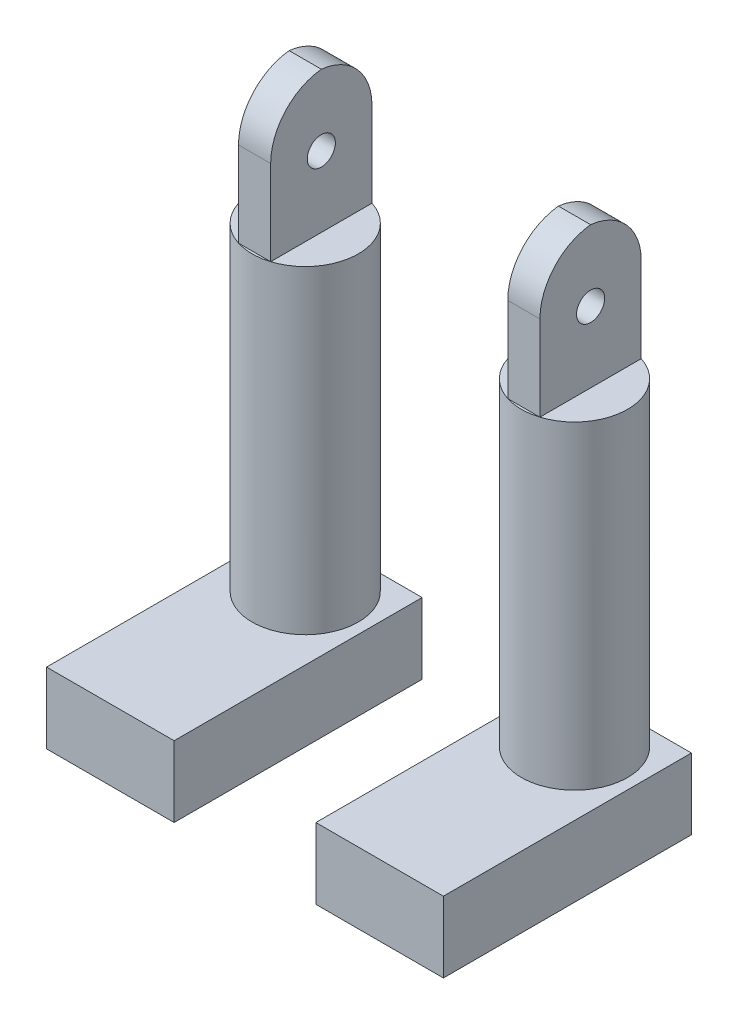
ISO-10303-21;
HEADER;
FILE_DESCRIPTION(('STEP AP214'),'2;1');
FILE_NAME('part.step','',(''),(''),'','','');
FILE_SCHEMA(('AUTOMOTIVE_DESIGN { 1 0 10303 214 1 1 1 1 }'));
ENDSEC;
DATA;
#1=APPLICATION_CONTEXT('core data for automotive mechanical design processes');
#2=APPLICATION_PROTOCOL_DEFINITION('international standard','automotive_design',2000,#1);
#3=PRODUCT_CONTEXT('',#1,'mechanical');
#4=PRODUCT('Part','Part','',(#3));
#5=PRODUCT_RELATED_PRODUCT_CATEGORY('part','',(#4));
#6=PRODUCT_DEFINITION_FORMATION('','',#4);
#7=PRODUCT_DEFINITION_CONTEXT('part definition',#1,'design');
#8=PRODUCT_DEFINITION('design','',#6,#7);
#9=PRODUCT_DEFINITION_SHAPE('','',#8);
#10=(LENGTH_UNIT() NAMED_UNIT(*) SI_UNIT(.MILLI.,.METRE.));
#11=(NAMED_UNIT(*) PLANE_ANGLE_UNIT() SI_UNIT($,.RADIAN.));
#12=(NAMED_UNIT(*) SI_UNIT($,.STERADIAN.) SOLID_ANGLE_UNIT());
#13=UNCERTAINTY_MEASURE_WITH_UNIT(LENGTH_MEASURE(1.E-05),#10,'distance_accuracy_value','');
#14=(GEOMETRIC_REPRESENTATION_CONTEXT(3) GLOBAL_UNCERTAINTY_ASSIGNED_CONTEXT((#13)) GLOBAL_UNIT_ASSIGNED_CONTEXT((#10,
#11,#12)) REPRESENTATION_CONTEXT('',''));
#15=CARTESIAN_POINT('',(0.,0.,0.));
#16=DIRECTION('',(0.,0.,1.));
#17=DIRECTION('',(1.,0.,0.));
#18=AXIS2_PLACEMENT_3D('',#15,#16,#17);
#19=CARTESIAN_POINT('',(-160.000000000001,550.,-100.));
#20=DIRECTION('',(0.,1.,0.));
#21=DIRECTION('',(0.,0.,1.));
#22=AXIS2_PLACEMENT_3D('',#19,#20,#21);
#23=PLANE('',#22);
#24=DIRECTION('',(0.,0.,-1.));
#25=VECTOR('',#24,1.);
#26=CARTESIAN_POINT('',(-137.290288108403,550.,-28.5208492929542));
#27=LINE('',#26,#25);
#28=CARTESIAN_POINT('',(-137.290288108403,550.,-28.5208492929542));
#29=VERTEX_POINT('',#28);
#30=CARTESIAN_POINT('',(-137.290288108403,550.,-171.479150707046));
#31=VERTEX_POINT('',#30);
#32=EDGE_CURVE('E166',#29,#31,#27,.T.);
#33=ORIENTED_EDGE('',*,*,#32,.F.);
#34=CARTESIAN_POINT('',(-160.000000000001,550.,-100.));
#35=DIRECTION('',(0.,1.,0.));
#36=DIRECTION('',(0.,0.,1.));
#37=AXIS2_PLACEMENT_3D('',#34,#35,#36);
#38=CIRCLE('',#37,75.);
#39=EDGE_CURVE('E149',#29,#31,#38,.T.);
#40=ORIENTED_EDGE('',*,*,#39,.T.);
#41=EDGE_LOOP('',(#33,#40));
#42=FACE_BOUND('',#41,.T.);
#43=ADVANCED_FACE('F49',(#42),#23,.T.);
#44=DIRECTION('',(1.,0.,0.));
#45=VECTOR('',#44,1.);
#46=CARTESIAN_POINT('',(-182.709711891599,550.,-28.5208492929542));
#47=LINE('',#46,#45);
#48=CARTESIAN_POINT('',(-182.709711891599,550.,-28.5208492929542));
#49=VERTEX_POINT('',#48);
#50=EDGE_CURVE('E162',#49,#29,#47,.T.);
#51=ORIENTED_EDGE('',*,*,#50,.F.);
#52=EDGE_CURVE('E157',#49,#29,#38,.T.);
#53=ORIENTED_EDGE('',*,*,#52,.T.);
#54=EDGE_LOOP('',(#51,#53));
#55=FACE_BOUND('',#54,.T.);
#56=ADVANCED_FACE('F266',(#55),#23,.T.);
#57=DIRECTION('',(0.,0.,1.));
#58=VECTOR('',#57,1.);
#59=CARTESIAN_POINT('',(-182.709711891599,550.,-28.5208492929542));
#60=LINE('',#59,#58);
#61=CARTESIAN_POINT('',(-182.709711891599,550.,-171.479150707046));
#62=VERTEX_POINT('',#61);
#63=EDGE_CURVE('E127',#62,#49,#60,.T.);
#64=ORIENTED_EDGE('',*,*,#63,.F.);
#65=EDGE_CURVE('E150',#62,#49,#38,.T.);
#66=ORIENTED_EDGE('',*,*,#65,.T.);
#67=EDGE_LOOP('',(#64,#66));
#68=FACE_BOUND('',#67,.T.);
#69=ADVANCED_FACE('F160',(#68),#23,.T.);
#70=CARTESIAN_POINT('',(-70.0000000000011,100.,175.));
#71=DIRECTION('',(-1.,0.,0.));
#72=DIRECTION('',(0.,0.,1.));
#73=AXIS2_PLACEMENT_3D('',#70,#71,#72);
#74=PLANE('',#73);
#75=DIRECTION('',(0.,0.,-1.));
#76=VECTOR('',#75,1.);
#77=CARTESIAN_POINT('',(-70.0000000000011,0.,175.));
#78=LINE('',#77,#76);
#79=CARTESIAN_POINT('',(-70.0000000000011,0.,175.));
#80=VERTEX_POINT('',#79);
#81=CARTESIAN_POINT('',(-70.0000000000011,0.,-175.));
#82=VERTEX_POINT('',#81);
#83=EDGE_CURVE('E186',#80,#82,#78,.T.);
#84=ORIENTED_EDGE('',*,*,#83,.T.);
#85=DIRECTION('',(0.,-1.,0.));
#86=VECTOR('',#85,1.);
#87=CARTESIAN_POINT('',(-70.0000000000011,100.,-175.));
#88=LINE('',#87,#86);
#89=CARTESIAN_POINT('',(-70.0000000000011,100.,-175.));
#90=VERTEX_POINT('',#89);
#91=EDGE_CURVE('E228',#90,#82,#88,.T.);
#92=ORIENTED_EDGE('',*,*,#91,.F.);
#93=DIRECTION('',(0.,0.,-1.));
#94=VECTOR('',#93,1.);
#95=CARTESIAN_POINT('',(-70.0000000000011,100.,175.));
#96=LINE('',#95,#94);
#97=CARTESIAN_POINT('',(-70.0000000000011,100.,175.));
#98=VERTEX_POINT('',#97);
#99=EDGE_CURVE('E190',#98,#90,#96,.T.);
#100=ORIENTED_EDGE('',*,*,#99,.F.);
#101=DIRECTION('',(0.,-1.,0.));
#102=VECTOR('',#101,1.);
#103=CARTESIAN_POINT('',(-70.0000000000011,100.,175.));
#104=LINE('',#103,#102);
#105=EDGE_CURVE('E205',#98,#80,#104,.T.);
#106=ORIENTED_EDGE('',*,*,#105,.T.);
#107=EDGE_LOOP('',(#84,#92,#100,#106));
#108=FACE_BOUND('',#107,.T.);
#109=ADVANCED_FACE('F293',(#108),#74,.F.);
#110=CARTESIAN_POINT('',(-250.000000000001,100.,-175.));
#111=DIRECTION('',(0.,0.,1.));
#112=DIRECTION('',(1.,0.,0.));
#113=AXIS2_PLACEMENT_3D('',#110,#111,#112);
#114=PLANE('',#113);
#115=DIRECTION('',(-1.,0.,0.));
#116=VECTOR('',#115,1.);
#117=CARTESIAN_POINT('',(-250.000000000001,0.,-175.));
#118=LINE('',#117,#116);
#119=CARTESIAN_POINT('',(-250.000000000001,0.,-175.));
#120=VERTEX_POINT('',#119);
#121=EDGE_CURVE('E209',#82,#120,#118,.T.);
#122=ORIENTED_EDGE('',*,*,#121,.T.);
#123=DIRECTION('',(0.,-1.,0.));
#124=VECTOR('',#123,1.);
#125=CARTESIAN_POINT('',(-250.000000000001,100.,-175.));
#126=LINE('',#125,#124);
#127=CARTESIAN_POINT('',(-250.000000000001,100.,-175.));
#128=VERTEX_POINT('',#127);
#129=EDGE_CURVE('E224',#128,#120,#126,.T.);
#130=ORIENTED_EDGE('',*,*,#129,.F.);
#131=DIRECTION('',(-1.,0.,0.));
#132=VECTOR('',#131,1.);
#133=CARTESIAN_POINT('',(-250.000000000001,100.,-175.));
#134=LINE('',#133,#132);
#135=CARTESIAN_POINT('',(-160.000000000001,100.,-175.));
#136=VERTEX_POINT('',#135);
#137=EDGE_CURVE('E194',#136,#128,#134,.T.);
#138=ORIENTED_EDGE('',*,*,#137,.F.);
#139=EDGE_CURVE('E196',#90,#136,#134,.T.);
#140=ORIENTED_EDGE('',*,*,#139,.F.);
#141=ORIENTED_EDGE('',*,*,#91,.T.);
#142=EDGE_LOOP('',(#122,#130,#138,#140,#141));
#143=FACE_BOUND('',#142,.T.);
#144=ADVANCED_FACE('F297',(#143),#114,.F.);
#145=CARTESIAN_POINT('',(-250.000000000001,100.,175.));
#146=DIRECTION('',(1.,0.,0.));
#147=DIRECTION('',(0.,0.,-1.));
#148=AXIS2_PLACEMENT_3D('',#145,#146,#147);
#149=PLANE('',#148);
#150=DIRECTION('',(0.,0.,1.));
#151=VECTOR('',#150,1.);
#152=CARTESIAN_POINT('',(-250.000000000001,0.,175.));
#153=LINE('',#152,#151);
#154=CARTESIAN_POINT('',(-250.000000000001,0.,175.));
#155=VERTEX_POINT('',#154);
#156=EDGE_CURVE('E212',#120,#155,#153,.T.);
#157=ORIENTED_EDGE('',*,*,#156,.T.);
#158=DIRECTION('',(0.,-1.,0.));
#159=VECTOR('',#158,1.);
#160=CARTESIAN_POINT('',(-250.000000000001,100.,175.));
#161=LINE('',#160,#159);
#162=CARTESIAN_POINT('',(-250.000000000001,100.,175.));
#163=VERTEX_POINT('',#162);
#164=EDGE_CURVE('E220',#163,#155,#161,.T.);
#165=ORIENTED_EDGE('',*,*,#164,.F.);
#166=DIRECTION('',(0.,0.,1.));
#167=VECTOR('',#166,1.);
#168=CARTESIAN_POINT('',(-250.000000000001,100.,175.));
#169=LINE('',#168,#167);
#170=EDGE_CURVE('E199',#128,#163,#169,.T.);
#171=ORIENTED_EDGE('',*,*,#170,.F.);
#172=ORIENTED_EDGE('',*,*,#129,.T.);
#173=EDGE_LOOP('',(#157,#165,#171,#172));
#174=FACE_BOUND('',#173,.T.);
#175=ADVANCED_FACE('F302',(#174),#149,.F.);
#176=CARTESIAN_POINT('',(-250.000000000001,100.,175.));
#177=DIRECTION('',(0.,0.,-1.));
#178=DIRECTION('',(-1.,0.,0.));
#179=AXIS2_PLACEMENT_3D('',#176,#177,#178);
#180=PLANE('',#179);
#181=DIRECTION('',(1.,0.,0.));
#182=VECTOR('',#181,1.);
#183=CARTESIAN_POINT('',(-250.000000000001,0.,175.));
#184=LINE('',#183,#182);
#185=EDGE_CURVE('E195',#155,#80,#184,.T.);
#186=ORIENTED_EDGE('',*,*,#185,.T.);
#187=ORIENTED_EDGE('',*,*,#105,.F.);
#188=DIRECTION('',(1.,0.,0.));
#189=VECTOR('',#188,1.);
#190=CARTESIAN_POINT('',(-250.000000000001,100.,175.));
#191=LINE('',#190,#189);
#192=EDGE_CURVE('E202',#163,#98,#191,.T.);
#193=ORIENTED_EDGE('',*,*,#192,.F.);
#194=ORIENTED_EDGE('',*,*,#164,.T.);
#195=EDGE_LOOP('',(#186,#187,#193,#194));
#196=FACE_BOUND('',#195,.T.);
#197=ADVANCED_FACE('F308',(#196),#180,.F.);
#198=CARTESIAN_POINT('',(0.,100.,0.));
#199=DIRECTION('',(0.,-1.,0.));
#200=DIRECTION('',(0.,0.,-1.));
#201=AXIS2_PLACEMENT_3D('',#198,#199,#200);
#202=PLANE('',#201);
#203=ORIENTED_EDGE('',*,*,#139,.T.);
#204=CARTESIAN_POINT('',(-160.000000000001,100.,-100.));
#205=DIRECTION('',(0.,1.,0.));
#206=DIRECTION('',(0.,0.,1.));
#207=AXIS2_PLACEMENT_3D('',#204,#205,#206);
#208=CIRCLE('',#207,75.);
#209=EDGE_CURVE('E183',#136,#136,#208,.T.);
#210=ORIENTED_EDGE('',*,*,#209,.F.);
#211=ORIENTED_EDGE('',*,*,#137,.T.);
#212=ORIENTED_EDGE('',*,*,#170,.T.);
#213=ORIENTED_EDGE('',*,*,#192,.T.);
#214=ORIENTED_EDGE('',*,*,#99,.T.);
#215=EDGE_LOOP('',(#203,#210,#211,#212,#213,#214));
#216=FACE_BOUND('',#215,.T.);
#217=ADVANCED_FACE('F312',(#216),#202,.F.);
#218=CARTESIAN_POINT('',(0.,0.,0.));
#219=DIRECTION('',(0.,-1.,0.));
#220=DIRECTION('',(0.,0.,-1.));
#221=AXIS2_PLACEMENT_3D('',#218,#219,#220);
#222=PLANE('',#221);
#223=ORIENTED_EDGE('',*,*,#83,.F.);
#224=ORIENTED_EDGE('',*,*,#185,.F.);
#225=ORIENTED_EDGE('',*,*,#156,.F.);
#226=ORIENTED_EDGE('',*,*,#121,.F.);
#227=EDGE_LOOP('',(#223,#224,#225,#226));
#228=FACE_BOUND('',#227,.T.);
#229=ADVANCED_FACE('F291',(#228),#222,.T.);
#230=CARTESIAN_POINT('',(-160.000000000001,550.,-100.));
#231=DIRECTION('',(0.,-1.,0.));
#232=DIRECTION('',(0.,0.,-1.));
#233=AXIS2_PLACEMENT_3D('',#230,#231,#232);
#234=CYLINDRICAL_SURFACE('',#233,75.);
#235=ORIENTED_EDGE('',*,*,#39,.F.);
#236=ORIENTED_EDGE('',*,*,#52,.F.);
#237=ORIENTED_EDGE('',*,*,#65,.F.);
#238=EDGE_CURVE('E141',#31,#62,#38,.T.);
#239=ORIENTED_EDGE('',*,*,#238,.F.);
#240=EDGE_LOOP('',(#235,#236,#237,#239));
#241=FACE_BOUND('',#240,.T.);
#242=ORIENTED_EDGE('',*,*,#209,.T.);
#243=EDGE_LOOP('',(#242));
#244=FACE_BOUND('',#243,.T.);
#245=ADVANCED_FACE('F154',(#241,#244),#234,.T.);
#246=DIRECTION('',(-1.,0.,0.));
#247=VECTOR('',#246,1.);
#248=CARTESIAN_POINT('',(-182.709711891599,550.,-171.479150707046));
#249=LINE('',#248,#247);
#250=EDGE_CURVE('E144',#31,#62,#249,.T.);
#251=ORIENTED_EDGE('',*,*,#250,.F.);
#252=ORIENTED_EDGE('',*,*,#238,.T.);
#253=EDGE_LOOP('',(#251,#252));
#254=FACE_BOUND('',#253,.T.);
#255=ADVANCED_FACE('F143',(#254),#23,.T.);
#256=CARTESIAN_POINT('',(-137.290288108403,750.,-28.5208492929542));
#257=DIRECTION('',(-1.,0.,0.));
#258=DIRECTION('',(0.,0.,1.));
#259=AXIS2_PLACEMENT_3D('',#256,#257,#258);
#260=PLANE('',#259);
#261=CARTESIAN_POINT('',(-137.290288108403,649.772462607082,-100.));
#262=DIRECTION('',(1.,0.,0.));
#263=DIRECTION('',(0.,0.,-1.));
#264=AXIS2_PLACEMENT_3D('',#261,#262,#263);
#265=CIRCLE('',#264,19.8124224852063);
#266=CARTESIAN_POINT('',(-137.290288108403,649.772462607082,-119.812422485207));
#267=VERTEX_POINT('',#266);
#268=EDGE_CURVE('E249',#267,#267,#265,.T.);
#269=ORIENTED_EDGE('',*,*,#268,.F.);
#270=EDGE_LOOP('',(#269));
#271=FACE_BOUND('',#270,.T.);
#272=DIRECTION('',(0.,-1.,0.));
#273=VECTOR('',#272,1.);
#274=CARTESIAN_POINT('',(-137.290288108403,750.,-171.479150707046));
#275=LINE('',#274,#273);
#276=CARTESIAN_POINT('',(-137.290288108403,670.,-171.479150707046));
#277=VERTEX_POINT('',#276);
#278=EDGE_CURVE('E135',#277,#31,#275,.T.);
#279=ORIENTED_EDGE('',*,*,#278,.F.);
#280=CARTESIAN_POINT('',(-137.290288108403,670.,-91.4791507070462));
#281=DIRECTION('',(-1.,0.,0.));
#282=DIRECTION('',(0.,0.,1.));
#283=AXIS2_PLACEMENT_3D('',#280,#281,#282);
#284=CIRCLE('',#283,80.);
#285=CARTESIAN_POINT('',(-137.290288108403,749.544925214163,-100.));
#286=VERTEX_POINT('',#285);
#287=EDGE_CURVE('E59',#277,#286,#284,.F.);
#288=ORIENTED_EDGE('',*,*,#287,.T.);
#289=CARTESIAN_POINT('',(-137.290288108403,670.,-108.520849292954));
#290=DIRECTION('',(-1.,0.,0.));
#291=DIRECTION('',(0.,0.,1.));
#292=AXIS2_PLACEMENT_3D('',#289,#290,#291);
#293=CIRCLE('',#292,80.);
#294=CARTESIAN_POINT('',(-137.290288108403,670.,-28.5208492929542));
#295=VERTEX_POINT('',#294);
#296=EDGE_CURVE('E70',#286,#295,#293,.F.);
#297=ORIENTED_EDGE('',*,*,#296,.T.);
#298=DIRECTION('',(0.,-1.,0.));
#299=VECTOR('',#298,1.);
#300=CARTESIAN_POINT('',(-137.290288108403,750.,-28.5208492929542));
#301=LINE('',#300,#299);
#302=EDGE_CURVE('E177',#295,#29,#301,.T.);
#303=ORIENTED_EDGE('',*,*,#302,.T.);
#304=ORIENTED_EDGE('',*,*,#32,.T.);
#305=EDGE_LOOP('',(#279,#288,#297,#303,#304));
#306=FACE_BOUND('',#305,.T.);
#307=ADVANCED_FACE('F259',(#271,#306),#260,.F.);
#308=CARTESIAN_POINT('',(-182.709711891599,750.,-171.479150707046));
#309=DIRECTION('',(0.,0.,1.));
#310=DIRECTION('',(1.,0.,0.));
#311=AXIS2_PLACEMENT_3D('',#308,#309,#310);
#312=PLANE('',#311);
#313=DIRECTION('',(0.,-1.,0.));
#314=VECTOR('',#313,1.);
#315=CARTESIAN_POINT('',(-182.709711891599,750.,-171.479150707046));
#316=LINE('',#315,#314);
#317=CARTESIAN_POINT('',(-182.709711891599,670.,-171.479150707046));
#318=VERTEX_POINT('',#317);
#319=EDGE_CURVE('E122',#318,#62,#316,.T.);
#320=ORIENTED_EDGE('',*,*,#319,.F.);
#321=DIRECTION('',(-1.,0.,0.));
#322=VECTOR('',#321,1.);
#323=CARTESIAN_POINT('',(-182.709711891599,670.,-171.479150707046));
#324=LINE('',#323,#322);
#325=EDGE_CURVE('E237',#318,#277,#324,.F.);
#326=ORIENTED_EDGE('',*,*,#325,.T.);
#327=ORIENTED_EDGE('',*,*,#278,.T.);
#328=ORIENTED_EDGE('',*,*,#250,.T.);
#329=EDGE_LOOP('',(#320,#326,#327,#328));
#330=FACE_BOUND('',#329,.T.);
#331=ADVANCED_FACE('F164',(#330),#312,.F.);
#332=CARTESIAN_POINT('',(-182.709711891599,750.,-28.5208492929542));
#333=DIRECTION('',(1.,0.,0.));
#334=DIRECTION('',(0.,0.,-1.));
#335=AXIS2_PLACEMENT_3D('',#332,#333,#334);
#336=PLANE('',#335);
#337=CARTESIAN_POINT('',(-182.709711891599,649.772462607082,-100.));
#338=DIRECTION('',(1.,0.,0.));
#339=DIRECTION('',(0.,0.,-1.));
#340=AXIS2_PLACEMENT_3D('',#337,#338,#339);
#341=CIRCLE('',#340,19.8124224852063);
#342=CARTESIAN_POINT('',(-182.709711891599,649.772462607082,-119.812422485207));
#343=VERTEX_POINT('',#342);
#344=EDGE_CURVE('E53',#343,#343,#341,.T.);
#345=ORIENTED_EDGE('',*,*,#344,.T.);
#346=EDGE_LOOP('',(#345));
#347=FACE_BOUND('',#346,.T.);
#348=CARTESIAN_POINT('',(-182.709711891599,670.,-108.520849292954));
#349=DIRECTION('',(1.,0.,0.));
#350=DIRECTION('',(0.,0.,-1.));
#351=AXIS2_PLACEMENT_3D('',#348,#349,#350);
#352=CIRCLE('',#351,80.);
#353=CARTESIAN_POINT('',(-182.709711891599,670.,-28.5208492929542));
#354=VERTEX_POINT('',#353);
#355=CARTESIAN_POINT('',(-182.709711891599,749.544925214163,-100.));
#356=VERTEX_POINT('',#355);
#357=EDGE_CURVE('E232',#354,#356,#352,.F.);
#358=ORIENTED_EDGE('',*,*,#357,.T.);
#359=CARTESIAN_POINT('',(-182.709711891599,670.,-91.4791507070462));
#360=DIRECTION('',(1.,0.,0.));
#361=DIRECTION('',(0.,0.,-1.));
#362=AXIS2_PLACEMENT_3D('',#359,#360,#361);
#363=CIRCLE('',#362,80.);
#364=EDGE_CURVE('E129',#356,#318,#363,.F.);
#365=ORIENTED_EDGE('',*,*,#364,.T.);
#366=ORIENTED_EDGE('',*,*,#319,.T.);
#367=ORIENTED_EDGE('',*,*,#63,.T.);
#368=DIRECTION('',(0.,-1.,0.));
#369=VECTOR('',#368,1.);
#370=CARTESIAN_POINT('',(-182.709711891599,750.,-28.5208492929542));
#371=LINE('',#370,#369);
#372=EDGE_CURVE('E136',#354,#49,#371,.T.);
#373=ORIENTED_EDGE('',*,*,#372,.F.);
#374=EDGE_LOOP('',(#358,#365,#366,#367,#373));
#375=FACE_BOUND('',#374,.T.);
#376=ADVANCED_FACE('F124',(#347,#375),#336,.F.);
#377=CARTESIAN_POINT('',(-182.709711891599,750.,-28.5208492929542));
#378=DIRECTION('',(0.,0.,-1.));
#379=DIRECTION('',(-1.,0.,0.));
#380=AXIS2_PLACEMENT_3D('',#377,#378,#379);
#381=PLANE('',#380);
#382=ORIENTED_EDGE('',*,*,#302,.F.);
#383=DIRECTION('',(1.,0.,0.));
#384=VECTOR('',#383,1.);
#385=CARTESIAN_POINT('',(-182.709711891599,670.,-28.5208492929542));
#386=LINE('',#385,#384);
#387=EDGE_CURVE('E12',#295,#354,#386,.F.);
#388=ORIENTED_EDGE('',*,*,#387,.T.);
#389=ORIENTED_EDGE('',*,*,#372,.T.);
#390=ORIENTED_EDGE('',*,*,#50,.T.);
#391=EDGE_LOOP('',(#382,#388,#389,#390));
#392=FACE_BOUND('',#391,.T.);
#393=ADVANCED_FACE('F269',(#392),#381,.F.);
#394=CARTESIAN_POINT('',(0.,670.,-108.520849292954));
#395=DIRECTION('',(1.,0.,0.));
#396=DIRECTION('',(0.,0.,-1.));
#397=AXIS2_PLACEMENT_3D('',#394,#395,#396);
#398=CYLINDRICAL_SURFACE('',#397,80.);
#399=ORIENTED_EDGE('',*,*,#387,.F.);
#400=ORIENTED_EDGE('',*,*,#296,.F.);
#401=DIRECTION('',(1.,0.,0.));
#402=VECTOR('',#401,1.);
#403=CARTESIAN_POINT('',(-160.000000000001,749.544925214163,-100.));
#404=LINE('',#403,#402);
#405=EDGE_CURVE('E170',#356,#286,#404,.T.);
#406=ORIENTED_EDGE('',*,*,#405,.F.);
#407=ORIENTED_EDGE('',*,*,#357,.F.);
#408=EDGE_LOOP('',(#399,#400,#406,#407));
#409=FACE_BOUND('',#408,.T.);
#410=ADVANCED_FACE('F51',(#409),#398,.T.);
#411=CARTESIAN_POINT('',(0.,670.,-91.4791507070462));
#412=DIRECTION('',(-1.,0.,0.));
#413=DIRECTION('',(0.,0.,1.));
#414=AXIS2_PLACEMENT_3D('',#411,#412,#413);
#415=CYLINDRICAL_SURFACE('',#414,80.);
#416=ORIENTED_EDGE('',*,*,#287,.F.);
#417=ORIENTED_EDGE('',*,*,#325,.F.);
#418=ORIENTED_EDGE('',*,*,#364,.F.);
#419=ORIENTED_EDGE('',*,*,#405,.T.);
#420=EDGE_LOOP('',(#416,#417,#418,#419));
#421=FACE_BOUND('',#420,.T.);
#422=ADVANCED_FACE('F273',(#421),#415,.T.);
#423=CARTESIAN_POINT('',(-716.290288108403,649.772462607082,-100.));
#424=DIRECTION('',(1.,0.,0.));
#425=DIRECTION('',(0.,0.,-1.));
#426=AXIS2_PLACEMENT_3D('',#423,#424,#425);
#427=CYLINDRICAL_SURFACE('',#426,19.8124224852063);
#428=ORIENTED_EDGE('',*,*,#268,.T.);
#429=EDGE_LOOP('',(#428));
#430=FACE_BOUND('',#429,.T.);
#431=ORIENTED_EDGE('',*,*,#344,.F.);
#432=EDGE_LOOP('',(#431));
#433=FACE_BOUND('',#432,.T.);
#434=ADVANCED_FACE('F256',(#430,#433),#427,.F.);
#435=CLOSED_SHELL('',(#43,#56,#69,#109,#144,#175,#197,#217,#229,#245,#255,#307,#331,#376,#393,
#410,#422,#434));
#436=MANIFOLD_SOLID_BREP('B2',#435);
#437=CARTESIAN_POINT('',(-540.000000000001,550.,-99.9999999999997));
#438=DIRECTION('',(0.,1.,0.));
#439=DIRECTION('',(0.,0.,1.));
#440=AXIS2_PLACEMENT_3D('',#437,#438,#439);
#441=PLANE('',#440);
#442=DIRECTION('',(0.,0.,-1.));
#443=VECTOR('',#442,1.);
#444=CARTESIAN_POINT('',(-517.290288108404,550.,-28.5208492929532));
#445=LINE('',#444,#443);
#446=CARTESIAN_POINT('',(-517.290288108404,550.,-28.5208492929532));
#447=VERTEX_POINT('',#446);
#448=CARTESIAN_POINT('',(-517.290288108404,550.,-171.479150707046));
#449=VERTEX_POINT('',#448);
#450=EDGE_CURVE('E550',#447,#449,#445,.T.);
#451=ORIENTED_EDGE('',*,*,#450,.F.);
#452=CARTESIAN_POINT('',(-540.000000000001,550.,-99.9999999999997));
#453=DIRECTION('',(0.,1.,0.));
#454=DIRECTION('',(0.,0.,1.));
#455=AXIS2_PLACEMENT_3D('',#452,#453,#454);
#456=CIRCLE('',#455,75.);
#457=EDGE_CURVE('E536',#447,#449,#456,.T.);
#458=ORIENTED_EDGE('',*,*,#457,.T.);
#459=EDGE_LOOP('',(#451,#458));
#460=FACE_BOUND('',#459,.T.);
#461=ADVANCED_FACE('F439',(#460),#441,.T.);
#462=DIRECTION('',(1.,0.,0.));
#463=VECTOR('',#462,1.);
#464=CARTESIAN_POINT('',(-562.709711891598,550.,-28.5208492929532));
#465=LINE('',#464,#463);
#466=CARTESIAN_POINT('',(-562.709711891598,550.,-28.5208492929533));
#467=VERTEX_POINT('',#466);
#468=EDGE_CURVE('E547',#467,#447,#465,.T.);
#469=ORIENTED_EDGE('',*,*,#468,.F.);
#470=EDGE_CURVE('E544',#467,#447,#456,.T.);
#471=ORIENTED_EDGE('',*,*,#470,.T.);
#472=EDGE_LOOP('',(#469,#471));
#473=FACE_BOUND('',#472,.T.);
#474=ADVANCED_FACE('F624',(#473),#441,.T.);
#475=DIRECTION('',(0.,0.,1.));
#476=VECTOR('',#475,1.);
#477=CARTESIAN_POINT('',(-562.709711891598,550.,-28.5208492929532));
#478=LINE('',#477,#476);
#479=CARTESIAN_POINT('',(-562.709711891598,550.,-171.479150707046));
#480=VERTEX_POINT('',#479);
#481=EDGE_CURVE('E516',#480,#467,#478,.T.);
#482=ORIENTED_EDGE('',*,*,#481,.F.);
#483=EDGE_CURVE('E537',#480,#467,#456,.T.);
#484=ORIENTED_EDGE('',*,*,#483,.T.);
#485=EDGE_LOOP('',(#482,#484));
#486=FACE_BOUND('',#485,.T.);
#487=ADVANCED_FACE('F546',(#486),#441,.T.);
#488=CARTESIAN_POINT('',(-450.000000000001,100.,175.));
#489=DIRECTION('',(-1.,0.,0.));
#490=DIRECTION('',(0.,0.,1.));
#491=AXIS2_PLACEMENT_3D('',#488,#489,#490);
#492=PLANE('',#491);
#493=DIRECTION('',(0.,0.,-1.));
#494=VECTOR('',#493,1.);
#495=CARTESIAN_POINT('',(-450.000000000001,0.,175.));
#496=LINE('',#495,#494);
#497=CARTESIAN_POINT('',(-450.000000000001,0.,175.));
#498=VERTEX_POINT('',#497);
#499=CARTESIAN_POINT('',(-450.000000000001,0.,-175.));
#500=VERTEX_POINT('',#499);
#501=EDGE_CURVE('E564',#498,#500,#496,.T.);
#502=ORIENTED_EDGE('',*,*,#501,.T.);
#503=DIRECTION('',(0.,-1.,0.));
#504=VECTOR('',#503,1.);
#505=CARTESIAN_POINT('',(-450.000000000001,100.,-175.));
#506=LINE('',#505,#504);
#507=CARTESIAN_POINT('',(-450.000000000001,100.,-175.));
#508=VERTEX_POINT('',#507);
#509=EDGE_CURVE('E594',#508,#500,#506,.T.);
#510=ORIENTED_EDGE('',*,*,#509,.F.);
#511=DIRECTION('',(0.,0.,-1.));
#512=VECTOR('',#511,1.);
#513=CARTESIAN_POINT('',(-450.000000000001,100.,175.));
#514=LINE('',#513,#512);
#515=CARTESIAN_POINT('',(-450.000000000001,100.,175.));
#516=VERTEX_POINT('',#515);
#517=EDGE_CURVE('E567',#516,#508,#514,.T.);
#518=ORIENTED_EDGE('',*,*,#517,.F.);
#519=DIRECTION('',(0.,-1.,0.));
#520=VECTOR('',#519,1.);
#521=CARTESIAN_POINT('',(-450.000000000001,100.,175.));
#522=LINE('',#521,#520);
#523=EDGE_CURVE('E578',#516,#498,#522,.T.);
#524=ORIENTED_EDGE('',*,*,#523,.T.);
#525=EDGE_LOOP('',(#502,#510,#518,#524));
#526=FACE_BOUND('',#525,.T.);
#527=ADVANCED_FACE('F642',(#526),#492,.F.);
#528=CARTESIAN_POINT('',(-630.000000000001,100.,-175.));
#529=DIRECTION('',(0.,0.,1.));
#530=DIRECTION('',(1.,0.,0.));
#531=AXIS2_PLACEMENT_3D('',#528,#529,#530);
#532=PLANE('',#531);
#533=DIRECTION('',(-1.,0.,0.));
#534=VECTOR('',#533,1.);
#535=CARTESIAN_POINT('',(-630.000000000001,0.,-175.));
#536=LINE('',#535,#534);
#537=CARTESIAN_POINT('',(-630.000000000001,0.,-175.));
#538=VERTEX_POINT('',#537);
#539=EDGE_CURVE('E581',#500,#538,#536,.T.);
#540=ORIENTED_EDGE('',*,*,#539,.T.);
#541=DIRECTION('',(0.,-1.,0.));
#542=VECTOR('',#541,1.);
#543=CARTESIAN_POINT('',(-630.000000000001,100.,-175.));
#544=LINE('',#543,#542);
#545=CARTESIAN_POINT('',(-630.000000000001,100.,-175.));
#546=VERTEX_POINT('',#545);
#547=EDGE_CURVE('E591',#546,#538,#544,.T.);
#548=ORIENTED_EDGE('',*,*,#547,.F.);
#549=DIRECTION('',(-1.,0.,0.));
#550=VECTOR('',#549,1.);
#551=CARTESIAN_POINT('',(-630.000000000001,100.,-175.));
#552=LINE('',#551,#550);
#553=CARTESIAN_POINT('',(-540.000000000001,100.,-175.));
#554=VERTEX_POINT('',#553);
#555=EDGE_CURVE('E570',#554,#546,#552,.T.);
#556=ORIENTED_EDGE('',*,*,#555,.F.);
#557=EDGE_CURVE('E572',#508,#554,#552,.T.);
#558=ORIENTED_EDGE('',*,*,#557,.F.);
#559=ORIENTED_EDGE('',*,*,#509,.T.);
#560=EDGE_LOOP('',(#540,#548,#556,#558,#559));
#561=FACE_BOUND('',#560,.T.);
#562=ADVANCED_FACE('F646',(#561),#532,.F.);
#563=CARTESIAN_POINT('',(-630.000000000001,100.,175.));
#564=DIRECTION('',(1.,0.,0.));
#565=DIRECTION('',(0.,0.,-1.));
#566=AXIS2_PLACEMENT_3D('',#563,#564,#565);
#567=PLANE('',#566);
#568=DIRECTION('',(0.,0.,1.));
#569=VECTOR('',#568,1.);
#570=CARTESIAN_POINT('',(-630.000000000001,0.,175.));
#571=LINE('',#570,#569);
#572=CARTESIAN_POINT('',(-630.000000000001,0.,175.));
#573=VERTEX_POINT('',#572);
#574=EDGE_CURVE('E583',#538,#573,#571,.T.);
#575=ORIENTED_EDGE('',*,*,#574,.T.);
#576=DIRECTION('',(0.,-1.,0.));
#577=VECTOR('',#576,1.);
#578=CARTESIAN_POINT('',(-630.000000000001,100.,175.));
#579=LINE('',#578,#577);
#580=CARTESIAN_POINT('',(-630.000000000001,100.,175.));
#581=VERTEX_POINT('',#580);
#582=EDGE_CURVE('E588',#581,#573,#579,.T.);
#583=ORIENTED_EDGE('',*,*,#582,.F.);
#584=DIRECTION('',(0.,0.,1.));
#585=VECTOR('',#584,1.);
#586=CARTESIAN_POINT('',(-630.000000000001,100.,175.));
#587=LINE('',#586,#585);
#588=EDGE_CURVE('E574',#546,#581,#587,.T.);
#589=ORIENTED_EDGE('',*,*,#588,.F.);
#590=ORIENTED_EDGE('',*,*,#547,.T.);
#591=EDGE_LOOP('',(#575,#583,#589,#590));
#592=FACE_BOUND('',#591,.T.);
#593=ADVANCED_FACE('F652',(#592),#567,.F.);
#594=CARTESIAN_POINT('',(-630.000000000001,100.,175.));
#595=DIRECTION('',(0.,0.,-1.));
#596=DIRECTION('',(-1.,0.,0.));
#597=AXIS2_PLACEMENT_3D('',#594,#595,#596);
#598=PLANE('',#597);
#599=DIRECTION('',(1.,0.,0.));
#600=VECTOR('',#599,1.);
#601=CARTESIAN_POINT('',(-630.000000000001,0.,175.));
#602=LINE('',#601,#600);
#603=EDGE_CURVE('E571',#573,#498,#602,.T.);
#604=ORIENTED_EDGE('',*,*,#603,.T.);
#605=ORIENTED_EDGE('',*,*,#523,.F.);
#606=DIRECTION('',(1.,0.,0.));
#607=VECTOR('',#606,1.);
#608=CARTESIAN_POINT('',(-630.000000000001,100.,175.));
#609=LINE('',#608,#607);
#610=EDGE_CURVE('E576',#581,#516,#609,.T.);
#611=ORIENTED_EDGE('',*,*,#610,.F.);
#612=ORIENTED_EDGE('',*,*,#582,.T.);
#613=EDGE_LOOP('',(#604,#605,#611,#612));
#614=FACE_BOUND('',#613,.T.);
#615=ADVANCED_FACE('F658',(#614),#598,.F.);
#616=CARTESIAN_POINT('',(0.,100.,0.));
#617=DIRECTION('',(0.,-1.,0.));
#618=DIRECTION('',(0.,0.,-1.));
#619=AXIS2_PLACEMENT_3D('',#616,#617,#618);
#620=PLANE('',#619);
#621=ORIENTED_EDGE('',*,*,#557,.T.);
#622=CARTESIAN_POINT('',(-540.000000000001,100.,-99.9999999999997));
#623=DIRECTION('',(0.,1.,0.));
#624=DIRECTION('',(0.,0.,1.));
#625=AXIS2_PLACEMENT_3D('',#622,#623,#624);
#626=CIRCLE('',#625,75.);
#627=EDGE_CURVE('E562',#554,#554,#626,.T.);
#628=ORIENTED_EDGE('',*,*,#627,.F.);
#629=ORIENTED_EDGE('',*,*,#555,.T.);
#630=ORIENTED_EDGE('',*,*,#588,.T.);
#631=ORIENTED_EDGE('',*,*,#610,.T.);
#632=ORIENTED_EDGE('',*,*,#517,.T.);
#633=EDGE_LOOP('',(#621,#628,#629,#630,#631,#632));
#634=FACE_BOUND('',#633,.T.);
#635=ADVANCED_FACE('F662',(#634),#620,.F.);
#636=CARTESIAN_POINT('',(0.,0.,0.));
#637=DIRECTION('',(0.,-1.,0.));
#638=DIRECTION('',(0.,0.,-1.));
#639=AXIS2_PLACEMENT_3D('',#636,#637,#638);
#640=PLANE('',#639);
#641=ORIENTED_EDGE('',*,*,#501,.F.);
#642=ORIENTED_EDGE('',*,*,#603,.F.);
#643=ORIENTED_EDGE('',*,*,#574,.F.);
#644=ORIENTED_EDGE('',*,*,#539,.F.);
#645=EDGE_LOOP('',(#641,#642,#643,#644));
#646=FACE_BOUND('',#645,.T.);
#647=ADVANCED_FACE('F640',(#646),#640,.T.);
#648=CARTESIAN_POINT('',(-540.000000000001,550.,-99.9999999999997));
#649=DIRECTION('',(0.,-1.,0.));
#650=DIRECTION('',(0.,0.,-1.));
#651=AXIS2_PLACEMENT_3D('',#648,#649,#650);
#652=CYLINDRICAL_SURFACE('',#651,75.);
#653=ORIENTED_EDGE('',*,*,#457,.F.);
#654=ORIENTED_EDGE('',*,*,#470,.F.);
#655=ORIENTED_EDGE('',*,*,#483,.F.);
#656=EDGE_CURVE('E529',#449,#480,#456,.T.);
#657=ORIENTED_EDGE('',*,*,#656,.F.);
#658=EDGE_LOOP('',(#653,#654,#655,#657));
#659=FACE_BOUND('',#658,.T.);
#660=ORIENTED_EDGE('',*,*,#627,.T.);
#661=EDGE_LOOP('',(#660));
#662=FACE_BOUND('',#661,.T.);
#663=ADVANCED_FACE('F541',(#659,#662),#652,.T.);
#664=DIRECTION('',(-1.,0.,0.));
#665=VECTOR('',#664,1.);
#666=CARTESIAN_POINT('',(-562.709711891598,550.,-171.479150707046));
#667=LINE('',#666,#665);
#668=EDGE_CURVE('E532',#449,#480,#667,.T.);
#669=ORIENTED_EDGE('',*,*,#668,.F.);
#670=ORIENTED_EDGE('',*,*,#656,.T.);
#671=EDGE_LOOP('',(#669,#670));
#672=FACE_BOUND('',#671,.T.);
#673=ADVANCED_FACE('F531',(#672),#441,.T.);
#674=CARTESIAN_POINT('',(-517.290288108404,750.,-28.5208492929532));
#675=DIRECTION('',(-1.,0.,0.));
#676=DIRECTION('',(0.,0.,1.));
#677=AXIS2_PLACEMENT_3D('',#674,#675,#676);
#678=PLANE('',#677);
#679=CARTESIAN_POINT('',(-517.290288108404,649.772462607082,-100.));
#680=DIRECTION('',(-1.,0.,0.));
#681=DIRECTION('',(0.,0.,1.));
#682=AXIS2_PLACEMENT_3D('',#679,#680,#681);
#683=CIRCLE('',#682,19.8124224852063);
#684=CARTESIAN_POINT('',(-517.290288108404,649.772462607082,-80.1875775147939));
#685=VERTEX_POINT('',#684);
#686=EDGE_CURVE('E604',#685,#685,#683,.T.);
#687=ORIENTED_EDGE('',*,*,#686,.T.);
#688=EDGE_LOOP('',(#687));
#689=FACE_BOUND('',#688,.T.);
#690=DIRECTION('',(0.,-1.,0.));
#691=VECTOR('',#690,1.);
#692=CARTESIAN_POINT('',(-517.290288108404,750.,-171.479150707046));
#693=LINE('',#692,#691);
#694=CARTESIAN_POINT('',(-517.290288108404,670.,-171.479150707046));
#695=VERTEX_POINT('',#694);
#696=EDGE_CURVE('E523',#695,#449,#693,.T.);
#697=ORIENTED_EDGE('',*,*,#696,.F.);
#698=CARTESIAN_POINT('',(-517.290288108404,670.,-91.4791507070462));
#699=DIRECTION('',(-1.,0.,0.));
#700=DIRECTION('',(0.,0.,1.));
#701=AXIS2_PLACEMENT_3D('',#698,#699,#700);
#702=CIRCLE('',#701,80.);
#703=CARTESIAN_POINT('',(-517.290288108404,749.544925214163,-99.9999999999997));
#704=VERTEX_POINT('',#703);
#705=EDGE_CURVE('E448',#695,#704,#702,.F.);
#706=ORIENTED_EDGE('',*,*,#705,.T.);
#707=CARTESIAN_POINT('',(-517.290288108404,670.,-108.520849292953));
#708=DIRECTION('',(-1.,0.,0.));
#709=DIRECTION('',(0.,0.,1.));
#710=AXIS2_PLACEMENT_3D('',#707,#708,#709);
#711=CIRCLE('',#710,80.);
#712=CARTESIAN_POINT('',(-517.290288108404,670.,-28.5208492929532));
#713=VERTEX_POINT('',#712);
#714=EDGE_CURVE('E459',#704,#713,#711,.F.);
#715=ORIENTED_EDGE('',*,*,#714,.T.);
#716=DIRECTION('',(0.,-1.,0.));
#717=VECTOR('',#716,1.);
#718=CARTESIAN_POINT('',(-517.290288108404,750.,-28.5208492929532));
#719=LINE('',#718,#717);
#720=EDGE_CURVE('E559',#713,#447,#719,.T.);
#721=ORIENTED_EDGE('',*,*,#720,.T.);
#722=ORIENTED_EDGE('',*,*,#450,.T.);
#723=EDGE_LOOP('',(#697,#706,#715,#721,#722));
#724=FACE_BOUND('',#723,.T.);
#725=ADVANCED_FACE('F635',(#689,#724),#678,.F.);
#726=CARTESIAN_POINT('',(-562.709711891598,750.,-171.479150707046));
#727=DIRECTION('',(0.,0.,1.));
#728=DIRECTION('',(1.,0.,0.));
#729=AXIS2_PLACEMENT_3D('',#726,#727,#728);
#730=PLANE('',#729);
#731=DIRECTION('',(0.,-1.,0.));
#732=VECTOR('',#731,1.);
#733=CARTESIAN_POINT('',(-562.709711891598,750.,-171.479150707046));
#734=LINE('',#733,#732);
#735=CARTESIAN_POINT('',(-562.709711891598,670.,-171.479150707046));
#736=VERTEX_POINT('',#735);
#737=EDGE_CURVE('E511',#736,#480,#734,.T.);
#738=ORIENTED_EDGE('',*,*,#737,.F.);
#739=DIRECTION('',(-1.,0.,0.));
#740=VECTOR('',#739,1.);
#741=CARTESIAN_POINT('',(-562.709711891598,670.,-171.479150707046));
#742=LINE('',#741,#740);
#743=EDGE_CURVE('E600',#736,#695,#742,.F.);
#744=ORIENTED_EDGE('',*,*,#743,.T.);
#745=ORIENTED_EDGE('',*,*,#696,.T.);
#746=ORIENTED_EDGE('',*,*,#668,.T.);
#747=EDGE_LOOP('',(#738,#744,#745,#746));
#748=FACE_BOUND('',#747,.T.);
#749=ADVANCED_FACE('F549',(#748),#730,.F.);
#750=CARTESIAN_POINT('',(-562.709711891598,750.,-28.5208492929532));
#751=DIRECTION('',(1.,0.,0.));
#752=DIRECTION('',(0.,0.,-1.));
#753=AXIS2_PLACEMENT_3D('',#750,#751,#752);
#754=PLANE('',#753);
#755=CARTESIAN_POINT('',(-562.709711891598,649.772462607082,-100.));
#756=DIRECTION('',(1.,0.,0.));
#757=DIRECTION('',(0.,0.,-1.));
#758=AXIS2_PLACEMENT_3D('',#755,#756,#757);
#759=CIRCLE('',#758,19.8124224852063);
#760=CARTESIAN_POINT('',(-562.709711891598,649.772462607082,-119.812422485207));
#761=VERTEX_POINT('',#760);
#762=EDGE_CURVE('E443',#761,#761,#759,.T.);
#763=ORIENTED_EDGE('',*,*,#762,.T.);
#764=EDGE_LOOP('',(#763));
#765=FACE_BOUND('',#764,.T.);
#766=CARTESIAN_POINT('',(-562.709711891598,670.,-108.520849292953));
#767=DIRECTION('',(1.,0.,0.));
#768=DIRECTION('',(0.,0.,-1.));
#769=AXIS2_PLACEMENT_3D('',#766,#767,#768);
#770=CIRCLE('',#769,80.);
#771=CARTESIAN_POINT('',(-562.709711891598,670.,-28.5208492929532));
#772=VERTEX_POINT('',#771);
#773=CARTESIAN_POINT('',(-562.709711891598,749.544925214163,-99.9999999999997));
#774=VERTEX_POINT('',#773);
#775=EDGE_CURVE('E597',#772,#774,#770,.F.);
#776=ORIENTED_EDGE('',*,*,#775,.T.);
#777=CARTESIAN_POINT('',(-562.709711891598,670.,-91.4791507070462));
#778=DIRECTION('',(1.,0.,0.));
#779=DIRECTION('',(0.,0.,-1.));
#780=AXIS2_PLACEMENT_3D('',#777,#778,#779);
#781=CIRCLE('',#780,80.);
#782=EDGE_CURVE('E518',#774,#736,#781,.F.);
#783=ORIENTED_EDGE('',*,*,#782,.T.);
#784=ORIENTED_EDGE('',*,*,#737,.T.);
#785=ORIENTED_EDGE('',*,*,#481,.T.);
#786=DIRECTION('',(0.,-1.,0.));
#787=VECTOR('',#786,1.);
#788=CARTESIAN_POINT('',(-562.709711891598,750.,-28.5208492929532));
#789=LINE('',#788,#787);
#790=EDGE_CURVE('E524',#772,#467,#789,.T.);
#791=ORIENTED_EDGE('',*,*,#790,.F.);
#792=EDGE_LOOP('',(#776,#783,#784,#785,#791));
#793=FACE_BOUND('',#792,.T.);
#794=ADVANCED_FACE('F513',(#765,#793),#754,.F.);
#795=CARTESIAN_POINT('',(-562.709711891598,750.,-28.5208492929532));
#796=DIRECTION('',(0.,0.,-1.));
#797=DIRECTION('',(-1.,0.,0.));
#798=AXIS2_PLACEMENT_3D('',#795,#796,#797);
#799=PLANE('',#798);
#800=ORIENTED_EDGE('',*,*,#720,.F.);
#801=DIRECTION('',(1.,0.,0.));
#802=VECTOR('',#801,1.);
#803=CARTESIAN_POINT('',(-562.709711891598,670.,-28.5208492929532));
#804=LINE('',#803,#802);
#805=EDGE_CURVE('E47',#713,#772,#804,.F.);
#806=ORIENTED_EDGE('',*,*,#805,.T.);
#807=ORIENTED_EDGE('',*,*,#790,.T.);
#808=ORIENTED_EDGE('',*,*,#468,.T.);
#809=EDGE_LOOP('',(#800,#806,#807,#808));
#810=FACE_BOUND('',#809,.T.);
#811=ADVANCED_FACE('F717',(#810),#799,.F.);
#812=CARTESIAN_POINT('',(0.,670.,-108.520849292953));
#813=DIRECTION('',(1.,0.,0.));
#814=DIRECTION('',(0.,0.,-1.));
#815=AXIS2_PLACEMENT_3D('',#812,#813,#814);
#816=CYLINDRICAL_SURFACE('',#815,80.);
#817=ORIENTED_EDGE('',*,*,#805,.F.);
#818=ORIENTED_EDGE('',*,*,#714,.F.);
#819=DIRECTION('',(1.,0.,0.));
#820=VECTOR('',#819,1.);
#821=CARTESIAN_POINT('',(-540.000000000001,749.544925214163,-99.9999999999997));
#822=LINE('',#821,#820);
#823=EDGE_CURVE('E553',#774,#704,#822,.T.);
#824=ORIENTED_EDGE('',*,*,#823,.F.);
#825=ORIENTED_EDGE('',*,*,#775,.F.);
#826=EDGE_LOOP('',(#817,#818,#824,#825));
#827=FACE_BOUND('',#826,.T.);
#828=ADVANCED_FACE('F441',(#827),#816,.T.);
#829=CARTESIAN_POINT('',(0.,670.,-91.4791507070462));
#830=DIRECTION('',(-1.,0.,0.));
#831=DIRECTION('',(0.,0.,1.));
#832=AXIS2_PLACEMENT_3D('',#829,#830,#831);
#833=CYLINDRICAL_SURFACE('',#832,80.);
#834=ORIENTED_EDGE('',*,*,#705,.F.);
#835=ORIENTED_EDGE('',*,*,#743,.F.);
#836=ORIENTED_EDGE('',*,*,#782,.F.);
#837=ORIENTED_EDGE('',*,*,#823,.T.);
#838=EDGE_LOOP('',(#834,#835,#836,#837));
#839=FACE_BOUND('',#838,.T.);
#840=ADVANCED_FACE('F617',(#839),#833,.T.);
#841=CARTESIAN_POINT('',(-716.290288108403,649.772462607082,-100.));
#842=DIRECTION('',(1.,0.,0.));
#843=DIRECTION('',(0.,0.,-1.));
#844=AXIS2_PLACEMENT_3D('',#841,#842,#843);
#845=CYLINDRICAL_SURFACE('',#844,19.8124224852063);
#846=ORIENTED_EDGE('',*,*,#762,.F.);
#847=EDGE_LOOP('',(#846));
#848=FACE_BOUND('',#847,.T.);
#849=ORIENTED_EDGE('',*,*,#686,.F.);
#850=EDGE_LOOP('',(#849));
#851=FACE_BOUND('',#850,.T.);
#852=ADVANCED_FACE('F614',(#848,#851),#845,.F.);
#853=CLOSED_SHELL('',(#461,#474,#487,#527,#562,#593,#615,#635,#647,#663,#673,#725,#749,#794,
#811,#828,#840,#852));
#854=MANIFOLD_SOLID_BREP('B6',#853);
#855=ADVANCED_BREP_SHAPE_REPRESENTATION('',(#18,#436,#854),#14);
#856=SHAPE_DEFINITION_REPRESENTATION(#9,#855);
ENDSEC;
END-ISO-10303-21;
